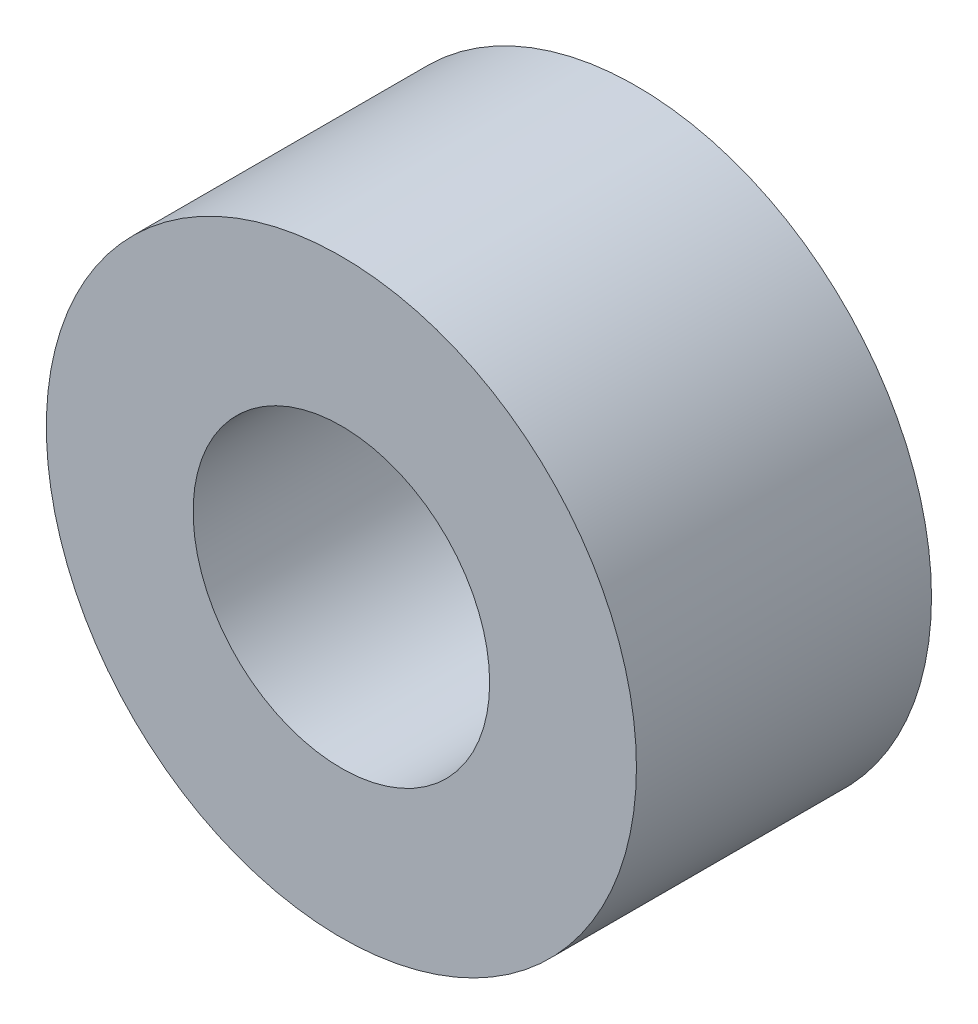
ISO-10303-21;
HEADER;
FILE_DESCRIPTION(('STEP AP214'),'2;1');
FILE_NAME('part.step','',(''),(''),'','','');
FILE_SCHEMA(('AUTOMOTIVE_DESIGN { 1 0 10303 214 1 1 1 1 }'));
ENDSEC;
DATA;
#1=APPLICATION_CONTEXT('core data for automotive mechanical design processes');
#2=APPLICATION_PROTOCOL_DEFINITION('international standard','automotive_design',2000,#1);
#3=PRODUCT_CONTEXT('',#1,'mechanical');
#4=PRODUCT('Part','Part','',(#3));
#5=PRODUCT_RELATED_PRODUCT_CATEGORY('part','',(#4));
#6=PRODUCT_DEFINITION_FORMATION('','',#4);
#7=PRODUCT_DEFINITION_CONTEXT('part definition',#1,'design');
#8=PRODUCT_DEFINITION('design','',#6,#7);
#9=PRODUCT_DEFINITION_SHAPE('','',#8);
#10=(LENGTH_UNIT() NAMED_UNIT(*) SI_UNIT(.MILLI.,.METRE.));
#11=(NAMED_UNIT(*) PLANE_ANGLE_UNIT() SI_UNIT($,.RADIAN.));
#12=(NAMED_UNIT(*) SI_UNIT($,.STERADIAN.) SOLID_ANGLE_UNIT());
#13=UNCERTAINTY_MEASURE_WITH_UNIT(LENGTH_MEASURE(1.E-05),#10,'distance_accuracy_value','');
#14=(GEOMETRIC_REPRESENTATION_CONTEXT(3) GLOBAL_UNCERTAINTY_ASSIGNED_CONTEXT((#13)) GLOBAL_UNIT_ASSIGNED_CONTEXT((#10,
#11,#12)) REPRESENTATION_CONTEXT('',''));
#15=CARTESIAN_POINT('',(0.,0.,0.));
#16=DIRECTION('',(0.,0.,1.));
#17=DIRECTION('',(1.,0.,0.));
#18=AXIS2_PLACEMENT_3D('',#15,#16,#17);
#19=CARTESIAN_POINT('',(0.,0.,10.));
#20=DIRECTION('',(0.,0.,-1.));
#21=DIRECTION('',(-1.,0.,0.));
#22=AXIS2_PLACEMENT_3D('',#19,#20,#21);
#23=CYLINDRICAL_SURFACE('',#22,10.);
#24=CARTESIAN_POINT('',(0.,0.,10.));
#25=DIRECTION('',(0.,0.,1.));
#26=DIRECTION('',(1.,0.,0.));
#27=AXIS2_PLACEMENT_3D('',#24,#25,#26);
#28=CIRCLE('',#27,10.);
#29=CARTESIAN_POINT('',(10.,0.,10.));
#30=VERTEX_POINT('',#29);
#31=EDGE_CURVE('E10',#30,#30,#28,.T.);
#32=ORIENTED_EDGE('',*,*,#31,.F.);
#33=EDGE_LOOP('',(#32));
#34=FACE_BOUND('',#33,.T.);
#35=CARTESIAN_POINT('',(0.,0.,0.));
#36=DIRECTION('',(0.,0.,1.));
#37=DIRECTION('',(1.,0.,0.));
#38=AXIS2_PLACEMENT_3D('',#35,#36,#37);
#39=CIRCLE('',#38,10.);
#40=CARTESIAN_POINT('',(10.,0.,0.));
#41=VERTEX_POINT('',#40);
#42=EDGE_CURVE('E37',#41,#41,#39,.T.);
#43=ORIENTED_EDGE('',*,*,#42,.T.);
#44=EDGE_LOOP('',(#43));
#45=FACE_BOUND('',#44,.T.);
#46=ADVANCED_FACE('F34',(#34,#45),#23,.T.);
#47=CARTESIAN_POINT('',(0.,0.,10.));
#48=DIRECTION('',(0.,0.,1.));
#49=DIRECTION('',(1.,0.,0.));
#50=AXIS2_PLACEMENT_3D('',#47,#48,#49);
#51=PLANE('',#50);
#52=CARTESIAN_POINT('',(0.,0.,10.));
#53=DIRECTION('',(0.,0.,1.));
#54=DIRECTION('',(1.,0.,0.));
#55=AXIS2_PLACEMENT_3D('',#52,#53,#54);
#56=CIRCLE('',#55,5.025);
#57=CARTESIAN_POINT('',(5.025,0.,10.));
#58=VERTEX_POINT('',#57);
#59=EDGE_CURVE('E46',#58,#58,#56,.T.);
#60=ORIENTED_EDGE('',*,*,#59,.F.);
#61=EDGE_LOOP('',(#60));
#62=FACE_BOUND('',#61,.T.);
#63=ORIENTED_EDGE('',*,*,#31,.T.);
#64=EDGE_LOOP('',(#63));
#65=FACE_BOUND('',#64,.T.);
#66=ADVANCED_FACE('F61',(#62,#65),#51,.T.);
#67=CARTESIAN_POINT('',(0.,0.,0.));
#68=DIRECTION('',(0.,0.,1.));
#69=DIRECTION('',(1.,0.,0.));
#70=AXIS2_PLACEMENT_3D('',#67,#68,#69);
#71=PLANE('',#70);
#72=CARTESIAN_POINT('',(0.,0.,0.));
#73=DIRECTION('',(0.,0.,1.));
#74=DIRECTION('',(1.,0.,0.));
#75=AXIS2_PLACEMENT_3D('',#72,#73,#74);
#76=CIRCLE('',#75,5.025);
#77=CARTESIAN_POINT('',(5.025,0.,0.));
#78=VERTEX_POINT('',#77);
#79=EDGE_CURVE('E44',#78,#78,#76,.T.);
#80=ORIENTED_EDGE('',*,*,#79,.T.);
#81=EDGE_LOOP('',(#80));
#82=FACE_BOUND('',#81,.T.);
#83=ORIENTED_EDGE('',*,*,#42,.F.);
#84=EDGE_LOOP('',(#83));
#85=FACE_BOUND('',#84,.T.);
#86=ADVANCED_FACE('F52',(#82,#85),#71,.F.);
#87=CARTESIAN_POINT('',(0.,0.,0.));
#88=DIRECTION('',(0.,0.,1.));
#89=DIRECTION('',(1.,0.,0.));
#90=AXIS2_PLACEMENT_3D('',#87,#88,#89);
#91=CYLINDRICAL_SURFACE('',#90,5.025);
#92=ORIENTED_EDGE('',*,*,#79,.F.);
#93=EDGE_LOOP('',(#92));
#94=FACE_BOUND('',#93,.T.);
#95=ORIENTED_EDGE('',*,*,#59,.T.);
#96=EDGE_LOOP('',(#95));
#97=FACE_BOUND('',#96,.T.);
#98=ADVANCED_FACE('F55',(#94,#97),#91,.F.);
#99=CLOSED_SHELL('',(#46,#66,#86,#98));
#100=MANIFOLD_SOLID_BREP('B2',#99);
#101=ADVANCED_BREP_SHAPE_REPRESENTATION('',(#18,#100),#14);
#102=SHAPE_DEFINITION_REPRESENTATION(#9,#101);
ENDSEC;
END-ISO-10303-21;
